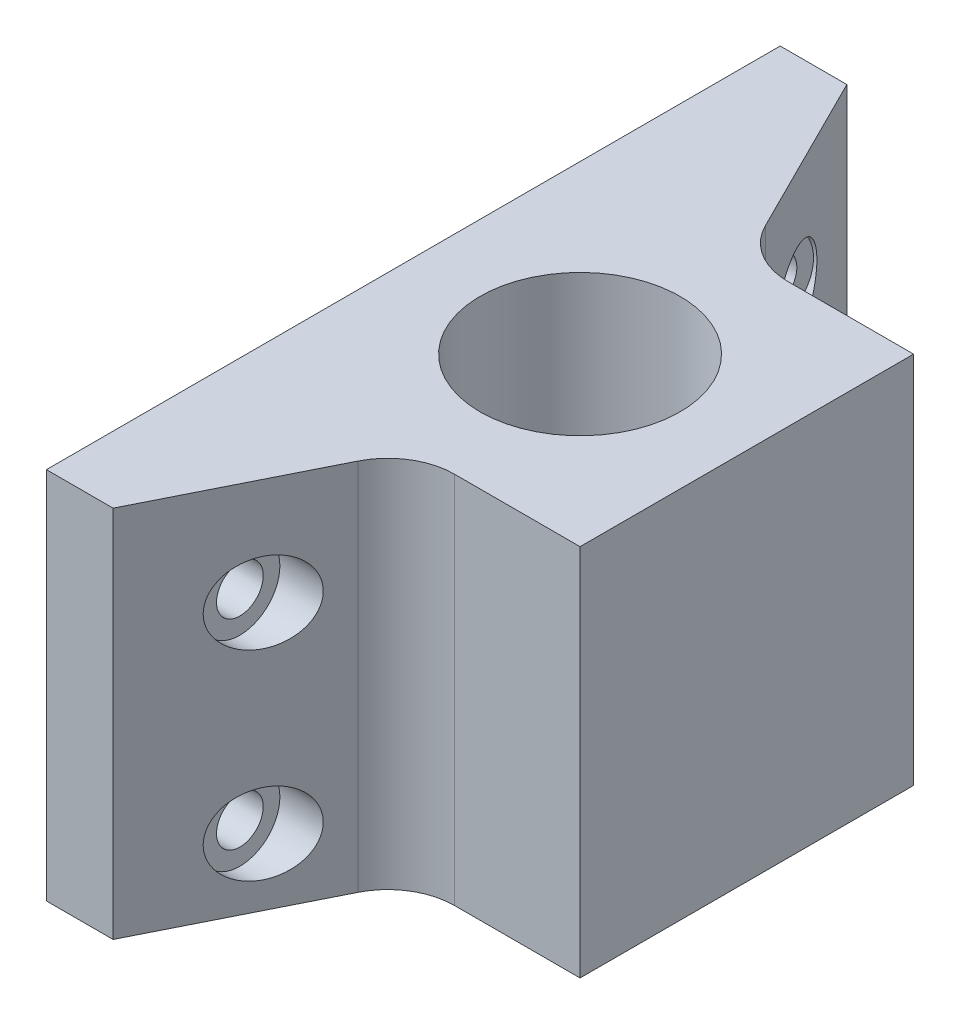
ISO-10303-21;
HEADER;
FILE_DESCRIPTION(('STEP AP214'),'2;1');
FILE_NAME('part.step','',(''),(''),'','','');
FILE_SCHEMA(('AUTOMOTIVE_DESIGN { 1 0 10303 214 1 1 1 1 }'));
ENDSEC;
DATA;
#1=APPLICATION_CONTEXT('core data for automotive mechanical design processes');
#2=APPLICATION_PROTOCOL_DEFINITION('international standard','automotive_design',2000,#1);
#3=PRODUCT_CONTEXT('',#1,'mechanical');
#4=PRODUCT('Part','Part','',(#3));
#5=PRODUCT_RELATED_PRODUCT_CATEGORY('part','',(#4));
#6=PRODUCT_DEFINITION_FORMATION('','',#4);
#7=PRODUCT_DEFINITION_CONTEXT('part definition',#1,'design');
#8=PRODUCT_DEFINITION('design','',#6,#7);
#9=PRODUCT_DEFINITION_SHAPE('','',#8);
#10=(LENGTH_UNIT() NAMED_UNIT(*) SI_UNIT(.MILLI.,.METRE.));
#11=(NAMED_UNIT(*) PLANE_ANGLE_UNIT() SI_UNIT($,.RADIAN.));
#12=(NAMED_UNIT(*) SI_UNIT($,.STERADIAN.) SOLID_ANGLE_UNIT());
#13=UNCERTAINTY_MEASURE_WITH_UNIT(LENGTH_MEASURE(1.E-05),#10,'distance_accuracy_value','');
#14=(GEOMETRIC_REPRESENTATION_CONTEXT(3) GLOBAL_UNCERTAINTY_ASSIGNED_CONTEXT((#13)) GLOBAL_UNIT_ASSIGNED_CONTEXT((#10,
#11,#12)) REPRESENTATION_CONTEXT('',''));
#15=CARTESIAN_POINT('',(0.,0.,0.));
#16=DIRECTION('',(0.,0.,1.));
#17=DIRECTION('',(1.,0.,0.));
#18=AXIS2_PLACEMENT_3D('',#15,#16,#17);
#19=CARTESIAN_POINT('',(0.500000000000002,5.,-20.));
#20=DIRECTION('',(-1.,0.,0.));
#21=DIRECTION('',(0.,0.,1.));
#22=AXIS2_PLACEMENT_3D('',#19,#20,#21);
#23=CYLINDRICAL_SURFACE('',#22,1.75);
#24=CARTESIAN_POINT('',(-12.5,5.,-20.));
#25=DIRECTION('',(-1.,0.,0.));
#26=DIRECTION('',(0.,0.,-1.));
#27=AXIS2_PLACEMENT_3D('',#24,#25,#26);
#28=CIRCLE('',#27,1.75);
#29=CARTESIAN_POINT('',(-12.5,5.,-21.75));
#30=VERTEX_POINT('',#29);
#31=EDGE_CURVE('E284',#30,#30,#28,.T.);
#32=ORIENTED_EDGE('',*,*,#31,.T.);
#33=EDGE_LOOP('',(#32));
#34=FACE_BOUND('',#33,.T.);
#35=CARTESIAN_POINT('',(-5.49999999999999,5.,-20.));
#36=DIRECTION('',(1.,0.,0.));
#37=DIRECTION('',(0.,0.,-1.));
#38=AXIS2_PLACEMENT_3D('',#35,#36,#37);
#39=CIRCLE('',#38,1.75);
#40=CARTESIAN_POINT('',(-5.49999999999999,5.,-21.75));
#41=VERTEX_POINT('',#40);
#42=EDGE_CURVE('E257',#41,#41,#39,.F.);
#43=ORIENTED_EDGE('',*,*,#42,.F.);
#44=EDGE_LOOP('',(#43));
#45=FACE_BOUND('',#44,.T.);
#46=ADVANCED_FACE('F43',(#34,#45),#23,.F.);
#47=CARTESIAN_POINT('',(0.500000000000002,20.,-20.));
#48=DIRECTION('',(-1.,0.,0.));
#49=DIRECTION('',(0.,0.,1.));
#50=AXIS2_PLACEMENT_3D('',#47,#48,#49);
#51=CYLINDRICAL_SURFACE('',#50,1.75);
#52=CARTESIAN_POINT('',(-12.5,20.,-20.));
#53=DIRECTION('',(-1.,0.,0.));
#54=DIRECTION('',(0.,0.,-1.));
#55=AXIS2_PLACEMENT_3D('',#52,#53,#54);
#56=CIRCLE('',#55,1.75);
#57=CARTESIAN_POINT('',(-12.5,20.,-21.75));
#58=VERTEX_POINT('',#57);
#59=EDGE_CURVE('E289',#58,#58,#56,.T.);
#60=ORIENTED_EDGE('',*,*,#59,.T.);
#61=EDGE_LOOP('',(#60));
#62=FACE_BOUND('',#61,.T.);
#63=CARTESIAN_POINT('',(-5.49999999999999,20.,-20.));
#64=DIRECTION('',(1.,0.,0.));
#65=DIRECTION('',(0.,0.,-1.));
#66=AXIS2_PLACEMENT_3D('',#63,#64,#65);
#67=CIRCLE('',#66,1.75);
#68=CARTESIAN_POINT('',(-5.49999999999999,20.,-21.75));
#69=VERTEX_POINT('',#68);
#70=EDGE_CURVE('E253',#69,#69,#67,.F.);
#71=ORIENTED_EDGE('',*,*,#70,.F.);
#72=EDGE_LOOP('',(#71));
#73=FACE_BOUND('',#72,.T.);
#74=ADVANCED_FACE('F356',(#62,#73),#51,.F.);
#75=CARTESIAN_POINT('',(-12.5,28.,-12.5));
#76=DIRECTION('',(0.,0.,1.));
#77=DIRECTION('',(1.,0.,0.));
#78=AXIS2_PLACEMENT_3D('',#75,#76,#77);
#79=PLANE('',#78);
#80=DIRECTION('',(-1.,0.,0.));
#81=VECTOR('',#80,1.);
#82=CARTESIAN_POINT('',(-12.5,0.,-12.5));
#83=LINE('',#82,#81);
#84=CARTESIAN_POINT('',(12.5,0.,-12.5));
#85=VERTEX_POINT('',#84);
#86=CARTESIAN_POINT('',(3.09016994374948,0.,-12.5));
#87=VERTEX_POINT('',#86);
#88=EDGE_CURVE('E211',#85,#87,#83,.T.);
#89=ORIENTED_EDGE('',*,*,#88,.T.);
#90=DIRECTION('',(0.,-1.,0.));
#91=VECTOR('',#90,1.);
#92=CARTESIAN_POINT('',(3.09016994374948,28.,-12.5));
#93=LINE('',#92,#91);
#94=CARTESIAN_POINT('',(3.09016994374948,28.,-12.5));
#95=VERTEX_POINT('',#94);
#96=EDGE_CURVE('E67',#87,#95,#93,.F.);
#97=ORIENTED_EDGE('',*,*,#96,.T.);
#98=DIRECTION('',(-1.,0.,0.));
#99=VECTOR('',#98,1.);
#100=CARTESIAN_POINT('',(-12.5,28.,-12.5));
#101=LINE('',#100,#99);
#102=CARTESIAN_POINT('',(12.5,28.,-12.5));
#103=VERTEX_POINT('',#102);
#104=EDGE_CURVE('E196',#103,#95,#101,.T.);
#105=ORIENTED_EDGE('',*,*,#104,.F.);
#106=DIRECTION('',(0.,-1.,0.));
#107=VECTOR('',#106,1.);
#108=CARTESIAN_POINT('',(12.5,28.,-12.5));
#109=LINE('',#108,#107);
#110=EDGE_CURVE('E223',#103,#85,#109,.T.);
#111=ORIENTED_EDGE('',*,*,#110,.T.);
#112=EDGE_LOOP('',(#89,#97,#105,#111));
#113=FACE_BOUND('',#112,.T.);
#114=ADVANCED_FACE('F331',(#113),#79,.F.);
#115=CARTESIAN_POINT('',(0.,-2.,0.));
#116=DIRECTION('',(0.,1.,0.));
#117=DIRECTION('',(0.,0.,1.));
#118=AXIS2_PLACEMENT_3D('',#115,#116,#117);
#119=CYLINDRICAL_SURFACE('',#118,5.);
#120=CARTESIAN_POINT('',(0.,0.,0.));
#121=DIRECTION('',(0.,1.,0.));
#122=DIRECTION('',(0.,0.,1.));
#123=AXIS2_PLACEMENT_3D('',#120,#121,#122);
#124=CIRCLE('',#123,5.);
#125=CARTESIAN_POINT('',(0.,0.,5.));
#126=VERTEX_POINT('',#125);
#127=EDGE_CURVE('E212',#126,#126,#124,.T.);
#128=ORIENTED_EDGE('',*,*,#127,.F.);
#129=EDGE_LOOP('',(#128));
#130=FACE_BOUND('',#129,.T.);
#131=CARTESIAN_POINT('',(0.,3.,0.));
#132=DIRECTION('',(0.,1.,0.));
#133=DIRECTION('',(0.,0.,1.));
#134=AXIS2_PLACEMENT_3D('',#131,#132,#133);
#135=CIRCLE('',#134,5.);
#136=CARTESIAN_POINT('',(0.,3.,5.));
#137=VERTEX_POINT('',#136);
#138=EDGE_CURVE('E191',#137,#137,#135,.F.);
#139=ORIENTED_EDGE('',*,*,#138,.F.);
#140=EDGE_LOOP('',(#139));
#141=FACE_BOUND('',#140,.T.);
#142=ADVANCED_FACE('F564',(#130,#141),#119,.F.);
#143=CARTESIAN_POINT('',(12.5,28.,-12.5));
#144=DIRECTION('',(-1.,0.,0.));
#145=DIRECTION('',(0.,0.,1.));
#146=AXIS2_PLACEMENT_3D('',#143,#144,#145);
#147=PLANE('',#146);
#148=DIRECTION('',(0.,0.,-1.));
#149=VECTOR('',#148,1.);
#150=CARTESIAN_POINT('',(12.5,0.,-12.5));
#151=LINE('',#150,#149);
#152=CARTESIAN_POINT('',(12.5,0.,12.5));
#153=VERTEX_POINT('',#152);
#154=EDGE_CURVE('E207',#153,#85,#151,.T.);
#155=ORIENTED_EDGE('',*,*,#154,.T.);
#156=ORIENTED_EDGE('',*,*,#110,.F.);
#157=DIRECTION('',(0.,0.,-1.));
#158=VECTOR('',#157,1.);
#159=CARTESIAN_POINT('',(12.5,28.,-12.5));
#160=LINE('',#159,#158);
#161=CARTESIAN_POINT('',(12.5,28.,12.5));
#162=VERTEX_POINT('',#161);
#163=EDGE_CURVE('E192',#162,#103,#160,.T.);
#164=ORIENTED_EDGE('',*,*,#163,.F.);
#165=DIRECTION('',(0.,-1.,0.));
#166=VECTOR('',#165,1.);
#167=CARTESIAN_POINT('',(12.5,28.,12.5));
#168=LINE('',#167,#166);
#169=EDGE_CURVE('E206',#162,#153,#168,.T.);
#170=ORIENTED_EDGE('',*,*,#169,.T.);
#171=EDGE_LOOP('',(#155,#156,#164,#170));
#172=FACE_BOUND('',#171,.T.);
#173=ADVANCED_FACE('F309',(#172),#147,.F.);
#174=CARTESIAN_POINT('',(-12.5,28.,-12.5));
#175=DIRECTION('',(1.,0.,0.));
#176=DIRECTION('',(0.,0.,-1.));
#177=AXIS2_PLACEMENT_3D('',#174,#175,#176);
#178=PLANE('',#177);
#179=CARTESIAN_POINT('',(-12.5,5.,20.));
#180=DIRECTION('',(-1.,0.,0.));
#181=DIRECTION('',(0.,0.,1.));
#182=AXIS2_PLACEMENT_3D('',#179,#180,#181);
#183=CIRCLE('',#182,1.75);
#184=CARTESIAN_POINT('',(-12.5,5.,21.75));
#185=VERTEX_POINT('',#184);
#186=EDGE_CURVE('E152',#185,#185,#183,.T.);
#187=ORIENTED_EDGE('',*,*,#186,.F.);
#188=EDGE_LOOP('',(#187));
#189=FACE_BOUND('',#188,.T.);
#190=ORIENTED_EDGE('',*,*,#59,.F.);
#191=EDGE_LOOP('',(#190));
#192=FACE_BOUND('',#191,.T.);
#193=ORIENTED_EDGE('',*,*,#31,.F.);
#194=EDGE_LOOP('',(#193));
#195=FACE_BOUND('',#194,.T.);
#196=CARTESIAN_POINT('',(-12.5,20.,20.));
#197=DIRECTION('',(-1.,0.,0.));
#198=DIRECTION('',(0.,0.,1.));
#199=AXIS2_PLACEMENT_3D('',#196,#197,#198);
#200=CIRCLE('',#199,1.75);
#201=CARTESIAN_POINT('',(-12.5,20.,21.75));
#202=VERTEX_POINT('',#201);
#203=EDGE_CURVE('E148',#202,#202,#200,.T.);
#204=ORIENTED_EDGE('',*,*,#203,.F.);
#205=EDGE_LOOP('',(#204));
#206=FACE_BOUND('',#205,.T.);
#207=DIRECTION('',(0.,0.,1.));
#208=VECTOR('',#207,1.);
#209=CARTESIAN_POINT('',(-12.5,0.,-12.5));
#210=LINE('',#209,#208);
#211=CARTESIAN_POINT('',(-12.5,0.,-27.5));
#212=VERTEX_POINT('',#211);
#213=CARTESIAN_POINT('',(-12.5,0.,27.5));
#214=VERTEX_POINT('',#213);
#215=EDGE_CURVE('E215',#212,#214,#210,.T.);
#216=ORIENTED_EDGE('',*,*,#215,.T.);
#217=DIRECTION('',(0.,-1.,0.));
#218=VECTOR('',#217,1.);
#219=CARTESIAN_POINT('',(-12.5,47.5256241897666,27.5));
#220=LINE('',#219,#218);
#221=CARTESIAN_POINT('',(-12.5,28.,27.5));
#222=VERTEX_POINT('',#221);
#223=EDGE_CURVE('E146',#222,#214,#220,.T.);
#224=ORIENTED_EDGE('',*,*,#223,.F.);
#225=DIRECTION('',(0.,0.,1.));
#226=VECTOR('',#225,1.);
#227=CARTESIAN_POINT('',(-12.5,28.,-12.5));
#228=LINE('',#227,#226);
#229=CARTESIAN_POINT('',(-12.5,28.,-27.5));
#230=VERTEX_POINT('',#229);
#231=EDGE_CURVE('E200',#230,#222,#228,.T.);
#232=ORIENTED_EDGE('',*,*,#231,.F.);
#233=DIRECTION('',(0.,-1.,0.));
#234=VECTOR('',#233,1.);
#235=CARTESIAN_POINT('',(-12.5,47.5256241897666,-27.5));
#236=LINE('',#235,#234);
#237=EDGE_CURVE('E165',#230,#212,#236,.T.);
#238=ORIENTED_EDGE('',*,*,#237,.T.);
#239=EDGE_LOOP('',(#216,#224,#232,#238));
#240=FACE_BOUND('',#239,.T.);
#241=ADVANCED_FACE('F305',(#189,#192,#195,#206,#240),#178,.F.);
#242=CARTESIAN_POINT('',(-12.5,28.,12.5));
#243=DIRECTION('',(0.,0.,-1.));
#244=DIRECTION('',(-1.,0.,0.));
#245=AXIS2_PLACEMENT_3D('',#242,#243,#244);
#246=PLANE('',#245);
#247=DIRECTION('',(1.,0.,0.));
#248=VECTOR('',#247,1.);
#249=CARTESIAN_POINT('',(-12.5,28.,12.5));
#250=LINE('',#249,#248);
#251=CARTESIAN_POINT('',(3.09016994374948,28.,12.5));
#252=VERTEX_POINT('',#251);
#253=EDGE_CURVE('E203',#252,#162,#250,.T.);
#254=ORIENTED_EDGE('',*,*,#253,.F.);
#255=DIRECTION('',(0.,-1.,0.));
#256=VECTOR('',#255,1.);
#257=CARTESIAN_POINT('',(3.09016994374948,28.,12.5));
#258=LINE('',#257,#256);
#259=CARTESIAN_POINT('',(3.09016994374948,0.,12.5));
#260=VERTEX_POINT('',#259);
#261=EDGE_CURVE('E227',#252,#260,#258,.T.);
#262=ORIENTED_EDGE('',*,*,#261,.T.);
#263=DIRECTION('',(1.,0.,0.));
#264=VECTOR('',#263,1.);
#265=CARTESIAN_POINT('',(-12.5,0.,12.5));
#266=LINE('',#265,#264);
#267=EDGE_CURVE('E197',#260,#153,#266,.T.);
#268=ORIENTED_EDGE('',*,*,#267,.T.);
#269=ORIENTED_EDGE('',*,*,#169,.F.);
#270=EDGE_LOOP('',(#254,#262,#268,#269));
#271=FACE_BOUND('',#270,.T.);
#272=ADVANCED_FACE('F308',(#271),#246,.F.);
#273=CARTESIAN_POINT('',(0.,28.,0.));
#274=DIRECTION('',(0.,1.,0.));
#275=DIRECTION('',(0.,0.,1.));
#276=AXIS2_PLACEMENT_3D('',#273,#274,#275);
#277=PLANE('',#276);
#278=CARTESIAN_POINT('',(0.,28.,0.));
#279=DIRECTION('',(0.,1.,0.));
#280=DIRECTION('',(0.,0.,1.));
#281=AXIS2_PLACEMENT_3D('',#278,#279,#280);
#282=CIRCLE('',#281,7.5);
#283=CARTESIAN_POINT('',(0.,28.,7.5));
#284=VERTEX_POINT('',#283);
#285=EDGE_CURVE('E173',#284,#284,#282,.T.);
#286=ORIENTED_EDGE('',*,*,#285,.F.);
#287=EDGE_LOOP('',(#286));
#288=FACE_BOUND('',#287,.T.);
#289=ORIENTED_EDGE('',*,*,#163,.T.);
#290=ORIENTED_EDGE('',*,*,#104,.T.);
#291=CARTESIAN_POINT('',(3.09016994374948,28.,-17.5));
#292=DIRECTION('',(0.,1.,0.));
#293=DIRECTION('',(0.,0.,1.));
#294=AXIS2_PLACEMENT_3D('',#291,#292,#293);
#295=CIRCLE('',#294,5.);
#296=CARTESIAN_POINT('',(-1.3819660112501,28.,-15.2639320225002));
#297=VERTEX_POINT('',#296);
#298=EDGE_CURVE('E12',#95,#297,#295,.F.);
#299=ORIENTED_EDGE('',*,*,#298,.T.);
#300=DIRECTION('',(0.447213595499958,0.,0.894427190999916));
#301=VECTOR('',#300,1.);
#302=CARTESIAN_POINT('',(-7.5,28.,-27.5));
#303=LINE('',#302,#301);
#304=CARTESIAN_POINT('',(-7.5,28.,-27.5));
#305=VERTEX_POINT('',#304);
#306=EDGE_CURVE('E169',#305,#297,#303,.T.);
#307=ORIENTED_EDGE('',*,*,#306,.F.);
#308=DIRECTION('',(1.,0.,0.));
#309=VECTOR('',#308,1.);
#310=CARTESIAN_POINT('',(-12.5,28.,-27.5));
#311=LINE('',#310,#309);
#312=EDGE_CURVE('E175',#230,#305,#311,.T.);
#313=ORIENTED_EDGE('',*,*,#312,.F.);
#314=ORIENTED_EDGE('',*,*,#231,.T.);
#315=DIRECTION('',(-1.,0.,0.));
#316=VECTOR('',#315,1.);
#317=CARTESIAN_POINT('',(-12.5,28.,27.5));
#318=LINE('',#317,#316);
#319=CARTESIAN_POINT('',(-7.5,28.,27.5));
#320=VERTEX_POINT('',#319);
#321=EDGE_CURVE('E141',#320,#222,#318,.T.);
#322=ORIENTED_EDGE('',*,*,#321,.F.);
#323=DIRECTION('',(-0.447213595499958,0.,0.894427190999916));
#324=VECTOR('',#323,1.);
#325=CARTESIAN_POINT('',(-7.5,28.,27.5));
#326=LINE('',#325,#324);
#327=CARTESIAN_POINT('',(-1.3819660112501,28.,15.2639320225002));
#328=VERTEX_POINT('',#327);
#329=EDGE_CURVE('E131',#328,#320,#326,.T.);
#330=ORIENTED_EDGE('',*,*,#329,.F.);
#331=CARTESIAN_POINT('',(3.09016994374948,28.,17.5));
#332=DIRECTION('',(0.,1.,0.));
#333=DIRECTION('',(0.,0.,1.));
#334=AXIS2_PLACEMENT_3D('',#331,#332,#333);
#335=CIRCLE('',#334,5.);
#336=EDGE_CURVE('E248',#328,#252,#335,.F.);
#337=ORIENTED_EDGE('',*,*,#336,.T.);
#338=ORIENTED_EDGE('',*,*,#253,.T.);
#339=EDGE_LOOP('',(#289,#290,#299,#307,#313,#314,#322,#330,#337,#338));
#340=FACE_BOUND('',#339,.T.);
#341=ADVANCED_FACE('F327',(#288,#340),#277,.T.);
#342=CARTESIAN_POINT('',(0.,0.,0.));
#343=DIRECTION('',(0.,1.,0.));
#344=DIRECTION('',(0.,0.,1.));
#345=AXIS2_PLACEMENT_3D('',#342,#343,#344);
#346=PLANE('',#345);
#347=ORIENTED_EDGE('',*,*,#127,.T.);
#348=EDGE_LOOP('',(#347));
#349=FACE_BOUND('',#348,.T.);
#350=ORIENTED_EDGE('',*,*,#154,.F.);
#351=ORIENTED_EDGE('',*,*,#267,.F.);
#352=CARTESIAN_POINT('',(3.09016994374948,0.,17.5));
#353=DIRECTION('',(0.,1.,0.));
#354=DIRECTION('',(0.,0.,1.));
#355=AXIS2_PLACEMENT_3D('',#352,#353,#354);
#356=CIRCLE('',#355,5.);
#357=CARTESIAN_POINT('',(-1.3819660112501,0.,15.2639320225002));
#358=VERTEX_POINT('',#357);
#359=EDGE_CURVE('E127',#260,#358,#356,.T.);
#360=ORIENTED_EDGE('',*,*,#359,.T.);
#361=DIRECTION('',(-0.447213595499958,0.,0.894427190999916));
#362=VECTOR('',#361,1.);
#363=CARTESIAN_POINT('',(-7.5,0.,27.5));
#364=LINE('',#363,#362);
#365=CARTESIAN_POINT('',(-7.5,0.,27.5));
#366=VERTEX_POINT('',#365);
#367=EDGE_CURVE('E120',#358,#366,#364,.T.);
#368=ORIENTED_EDGE('',*,*,#367,.T.);
#369=DIRECTION('',(-1.,0.,0.));
#370=VECTOR('',#369,1.);
#371=CARTESIAN_POINT('',(-12.5,0.,27.5));
#372=LINE('',#371,#370);
#373=EDGE_CURVE('E125',#366,#214,#372,.T.);
#374=ORIENTED_EDGE('',*,*,#373,.T.);
#375=ORIENTED_EDGE('',*,*,#215,.F.);
#376=DIRECTION('',(1.,0.,0.));
#377=VECTOR('',#376,1.);
#378=CARTESIAN_POINT('',(-12.5,0.,-27.5));
#379=LINE('',#378,#377);
#380=CARTESIAN_POINT('',(-7.5,0.,-27.5));
#381=VERTEX_POINT('',#380);
#382=EDGE_CURVE('E161',#212,#381,#379,.T.);
#383=ORIENTED_EDGE('',*,*,#382,.T.);
#384=DIRECTION('',(0.447213595499958,0.,0.894427190999916));
#385=VECTOR('',#384,1.);
#386=CARTESIAN_POINT('',(-7.5,0.,-27.5));
#387=LINE('',#386,#385);
#388=CARTESIAN_POINT('',(-1.3819660112501,0.,-15.2639320225002));
#389=VERTEX_POINT('',#388);
#390=EDGE_CURVE('E162',#381,#389,#387,.T.);
#391=ORIENTED_EDGE('',*,*,#390,.T.);
#392=CARTESIAN_POINT('',(3.09016994374948,0.,-17.5));
#393=DIRECTION('',(0.,1.,0.));
#394=DIRECTION('',(0.,0.,1.));
#395=AXIS2_PLACEMENT_3D('',#392,#393,#394);
#396=CIRCLE('',#395,5.);
#397=EDGE_CURVE('E53',#389,#87,#396,.T.);
#398=ORIENTED_EDGE('',*,*,#397,.T.);
#399=ORIENTED_EDGE('',*,*,#88,.F.);
#400=EDGE_LOOP('',(#350,#351,#360,#368,#374,#375,#383,#391,#398,#399));
#401=FACE_BOUND('',#400,.T.);
#402=ADVANCED_FACE('F123',(#349,#401),#346,.F.);
#403=CARTESIAN_POINT('',(0.,3.,0.));
#404=DIRECTION('',(0.,1.,0.));
#405=DIRECTION('',(0.,0.,1.));
#406=AXIS2_PLACEMENT_3D('',#403,#404,#405);
#407=PLANE('',#406);
#408=CARTESIAN_POINT('',(0.,3.,0.));
#409=DIRECTION('',(0.,1.,0.));
#410=DIRECTION('',(0.,0.,1.));
#411=AXIS2_PLACEMENT_3D('',#408,#409,#410);
#412=CIRCLE('',#411,7.5);
#413=CARTESIAN_POINT('',(0.,3.,7.5));
#414=VERTEX_POINT('',#413);
#415=EDGE_CURVE('E187',#414,#414,#412,.F.);
#416=ORIENTED_EDGE('',*,*,#415,.F.);
#417=EDGE_LOOP('',(#416));
#418=FACE_BOUND('',#417,.T.);
#419=ORIENTED_EDGE('',*,*,#138,.T.);
#420=EDGE_LOOP('',(#419));
#421=FACE_BOUND('',#420,.T.);
#422=ADVANCED_FACE('F351',(#418,#421),#407,.T.);
#423=CARTESIAN_POINT('',(0.,-21.2132034355964,0.));
#424=DIRECTION('',(0.,1.,0.));
#425=DIRECTION('',(0.,0.,1.));
#426=AXIS2_PLACEMENT_3D('',#423,#424,#425);
#427=CYLINDRICAL_SURFACE('',#426,7.5);
#428=ORIENTED_EDGE('',*,*,#415,.T.);
#429=EDGE_LOOP('',(#428));
#430=FACE_BOUND('',#429,.T.);
#431=ORIENTED_EDGE('',*,*,#285,.T.);
#432=EDGE_LOOP('',(#431));
#433=FACE_BOUND('',#432,.T.);
#434=ADVANCED_FACE('F342',(#430,#433),#427,.F.);
#435=CARTESIAN_POINT('',(-12.5,47.5256241897666,-27.5));
#436=DIRECTION('',(0.,0.,-1.));
#437=DIRECTION('',(-1.,0.,0.));
#438=AXIS2_PLACEMENT_3D('',#435,#436,#437);
#439=PLANE('',#438);
#440=ORIENTED_EDGE('',*,*,#237,.F.);
#441=ORIENTED_EDGE('',*,*,#312,.T.);
#442=DIRECTION('',(0.,-1.,0.));
#443=VECTOR('',#442,1.);
#444=CARTESIAN_POINT('',(-7.5,47.5256241897666,-27.5));
#445=LINE('',#444,#443);
#446=EDGE_CURVE('E174',#305,#381,#445,.T.);
#447=ORIENTED_EDGE('',*,*,#446,.T.);
#448=ORIENTED_EDGE('',*,*,#382,.F.);
#449=EDGE_LOOP('',(#440,#441,#447,#448));
#450=FACE_BOUND('',#449,.T.);
#451=ADVANCED_FACE('F340',(#450),#439,.T.);
#452=CARTESIAN_POINT('',(-7.5,47.5256241897666,-27.5));
#453=DIRECTION('',(0.894427190999916,0.,-0.447213595499958));
#454=DIRECTION('',(-0.447213595499958,0.,-0.894427190999916));
#455=AXIS2_PLACEMENT_3D('',#452,#453,#454);
#456=PLANE('',#455);
#457=CARTESIAN_POINT('',(-3.75,5.,-20.));
#458=DIRECTION('',(0.894427190999916,0.,-0.447213595499958));
#459=DIRECTION('',(0.447213595499958,0.,0.894427190999916));
#460=AXIS2_PLACEMENT_3D('',#457,#458,#459);
#461=ELLIPSE('',#460,3.35410196624968,3.);
#462=CARTESIAN_POINT('',(-2.25,5.,-17.));
#463=VERTEX_POINT('',#462);
#464=EDGE_CURVE('E47',#463,#463,#461,.T.);
#465=ORIENTED_EDGE('',*,*,#464,.F.);
#466=EDGE_LOOP('',(#465));
#467=FACE_BOUND('',#466,.T.);
#468=CARTESIAN_POINT('',(-3.75,20.,-20.));
#469=DIRECTION('',(0.894427190999916,0.,-0.447213595499958));
#470=DIRECTION('',(0.447213595499958,0.,0.894427190999916));
#471=AXIS2_PLACEMENT_3D('',#468,#469,#470);
#472=ELLIPSE('',#471,3.35410196624968,3.);
#473=CARTESIAN_POINT('',(-2.25,20.,-17.));
#474=VERTEX_POINT('',#473);
#475=EDGE_CURVE('E277',#474,#474,#472,.T.);
#476=ORIENTED_EDGE('',*,*,#475,.F.);
#477=EDGE_LOOP('',(#476));
#478=FACE_BOUND('',#477,.T.);
#479=ORIENTED_EDGE('',*,*,#306,.T.);
#480=DIRECTION('',(0.,-1.,0.));
#481=VECTOR('',#480,1.);
#482=CARTESIAN_POINT('',(-1.3819660112501,47.5256241897666,-15.2639320225002));
#483=LINE('',#482,#481);
#484=EDGE_CURVE('E240',#297,#389,#483,.T.);
#485=ORIENTED_EDGE('',*,*,#484,.T.);
#486=ORIENTED_EDGE('',*,*,#390,.F.);
#487=ORIENTED_EDGE('',*,*,#446,.F.);
#488=EDGE_LOOP('',(#479,#485,#486,#487));
#489=FACE_BOUND('',#488,.T.);
#490=ADVANCED_FACE('F322',(#467,#478,#489),#456,.T.);
#491=CARTESIAN_POINT('',(-7.5,47.5256241897666,27.5));
#492=DIRECTION('',(0.894427190999916,0.,0.447213595499958));
#493=DIRECTION('',(0.447213595499958,0.,-0.894427190999916));
#494=AXIS2_PLACEMENT_3D('',#491,#492,#493);
#495=PLANE('',#494);
#496=CARTESIAN_POINT('',(-3.75,20.,20.));
#497=DIRECTION('',(0.894427190999916,0.,0.447213595499958));
#498=DIRECTION('',(0.447213595499958,0.,-0.894427190999916));
#499=AXIS2_PLACEMENT_3D('',#496,#497,#498);
#500=ELLIPSE('',#499,3.35410196624968,3.);
#501=CARTESIAN_POINT('',(-2.25,20.,17.));
#502=VERTEX_POINT('',#501);
#503=EDGE_CURVE('E274',#502,#502,#500,.T.);
#504=ORIENTED_EDGE('',*,*,#503,.F.);
#505=EDGE_LOOP('',(#504));
#506=FACE_BOUND('',#505,.T.);
#507=CARTESIAN_POINT('',(-3.75,5.,20.));
#508=DIRECTION('',(0.894427190999916,0.,0.447213595499958));
#509=DIRECTION('',(0.447213595499958,0.,-0.894427190999916));
#510=AXIS2_PLACEMENT_3D('',#507,#508,#509);
#511=ELLIPSE('',#510,3.35410196624968,3.);
#512=CARTESIAN_POINT('',(-2.25,5.,17.));
#513=VERTEX_POINT('',#512);
#514=EDGE_CURVE('E270',#513,#513,#511,.T.);
#515=ORIENTED_EDGE('',*,*,#514,.F.);
#516=EDGE_LOOP('',(#515));
#517=FACE_BOUND('',#516,.T.);
#518=ORIENTED_EDGE('',*,*,#367,.F.);
#519=DIRECTION('',(0.,-1.,0.));
#520=VECTOR('',#519,1.);
#521=CARTESIAN_POINT('',(-1.3819660112501,47.5256241897666,15.2639320225002));
#522=LINE('',#521,#520);
#523=EDGE_CURVE('E237',#358,#328,#522,.F.);
#524=ORIENTED_EDGE('',*,*,#523,.T.);
#525=ORIENTED_EDGE('',*,*,#329,.T.);
#526=DIRECTION('',(0.,-1.,0.));
#527=VECTOR('',#526,1.);
#528=CARTESIAN_POINT('',(-7.5,47.5256241897666,27.5));
#529=LINE('',#528,#527);
#530=EDGE_CURVE('E134',#320,#366,#529,.T.);
#531=ORIENTED_EDGE('',*,*,#530,.T.);
#532=EDGE_LOOP('',(#518,#524,#525,#531));
#533=FACE_BOUND('',#532,.T.);
#534=ADVANCED_FACE('F135',(#506,#517,#533),#495,.T.);
#535=CARTESIAN_POINT('',(-12.5,47.5256241897666,27.5));
#536=DIRECTION('',(0.,0.,1.));
#537=DIRECTION('',(1.,0.,0.));
#538=AXIS2_PLACEMENT_3D('',#535,#536,#537);
#539=PLANE('',#538);
#540=ORIENTED_EDGE('',*,*,#530,.F.);
#541=ORIENTED_EDGE('',*,*,#321,.T.);
#542=ORIENTED_EDGE('',*,*,#223,.T.);
#543=ORIENTED_EDGE('',*,*,#373,.F.);
#544=EDGE_LOOP('',(#540,#541,#542,#543));
#545=FACE_BOUND('',#544,.T.);
#546=ADVANCED_FACE('F144',(#545),#539,.T.);
#547=CARTESIAN_POINT('',(3.09016994374948,28.,17.5));
#548=DIRECTION('',(0.,-1.,0.));
#549=DIRECTION('',(0.,0.,-1.));
#550=AXIS2_PLACEMENT_3D('',#547,#548,#549);
#551=CYLINDRICAL_SURFACE('',#550,5.);
#552=ORIENTED_EDGE('',*,*,#336,.F.);
#553=ORIENTED_EDGE('',*,*,#523,.F.);
#554=ORIENTED_EDGE('',*,*,#359,.F.);
#555=ORIENTED_EDGE('',*,*,#261,.F.);
#556=EDGE_LOOP('',(#552,#553,#554,#555));
#557=FACE_BOUND('',#556,.T.);
#558=ADVANCED_FACE('F339',(#557),#551,.F.);
#559=CARTESIAN_POINT('',(3.09016994374948,47.5256241897666,-17.5));
#560=DIRECTION('',(0.,-1.,0.));
#561=DIRECTION('',(0.,0.,-1.));
#562=AXIS2_PLACEMENT_3D('',#559,#560,#561);
#563=CYLINDRICAL_SURFACE('',#562,5.);
#564=ORIENTED_EDGE('',*,*,#298,.F.);
#565=ORIENTED_EDGE('',*,*,#96,.F.);
#566=ORIENTED_EDGE('',*,*,#397,.F.);
#567=ORIENTED_EDGE('',*,*,#484,.F.);
#568=EDGE_LOOP('',(#564,#565,#566,#567));
#569=FACE_BOUND('',#568,.T.);
#570=ADVANCED_FACE('F45',(#569),#563,.F.);
#571=CARTESIAN_POINT('',(0.500000000000009,20.,20.));
#572=DIRECTION('',(-1.,0.,0.));
#573=DIRECTION('',(0.,0.,1.));
#574=AXIS2_PLACEMENT_3D('',#571,#572,#573);
#575=CYLINDRICAL_SURFACE('',#574,1.75);
#576=CARTESIAN_POINT('',(-5.5,20.,20.));
#577=DIRECTION('',(-1.,0.,0.));
#578=DIRECTION('',(0.,0.,1.));
#579=AXIS2_PLACEMENT_3D('',#576,#577,#578);
#580=CIRCLE('',#579,1.75);
#581=CARTESIAN_POINT('',(-5.5,20.,21.75));
#582=VERTEX_POINT('',#581);
#583=EDGE_CURVE('E266',#582,#582,#580,.F.);
#584=ORIENTED_EDGE('',*,*,#583,.T.);
#585=EDGE_LOOP('',(#584));
#586=FACE_BOUND('',#585,.T.);
#587=ORIENTED_EDGE('',*,*,#203,.T.);
#588=EDGE_LOOP('',(#587));
#589=FACE_BOUND('',#588,.T.);
#590=ADVANCED_FACE('F371',(#586,#589),#575,.F.);
#591=CARTESIAN_POINT('',(0.500000000000009,5.,20.));
#592=DIRECTION('',(-1.,0.,0.));
#593=DIRECTION('',(0.,0.,1.));
#594=AXIS2_PLACEMENT_3D('',#591,#592,#593);
#595=CYLINDRICAL_SURFACE('',#594,1.75);
#596=CARTESIAN_POINT('',(-5.5,5.,20.));
#597=DIRECTION('',(-1.,0.,0.));
#598=DIRECTION('',(0.,0.,1.));
#599=AXIS2_PLACEMENT_3D('',#596,#597,#598);
#600=CIRCLE('',#599,1.75);
#601=CARTESIAN_POINT('',(-5.5,5.,21.75));
#602=VERTEX_POINT('',#601);
#603=EDGE_CURVE('E262',#602,#602,#600,.F.);
#604=ORIENTED_EDGE('',*,*,#603,.T.);
#605=EDGE_LOOP('',(#604));
#606=FACE_BOUND('',#605,.T.);
#607=ORIENTED_EDGE('',*,*,#186,.T.);
#608=EDGE_LOOP('',(#607));
#609=FACE_BOUND('',#608,.T.);
#610=ADVANCED_FACE('F303',(#606,#609),#595,.F.);
#611=CARTESIAN_POINT('',(-5.49999999999999,20.,-20.));
#612=DIRECTION('',(1.,0.,0.));
#613=DIRECTION('',(0.,0.,-1.));
#614=AXIS2_PLACEMENT_3D('',#611,#612,#613);
#615=PLANE('',#614);
#616=CARTESIAN_POINT('',(-5.49999999999999,20.,-20.));
#617=DIRECTION('',(1.,0.,0.));
#618=DIRECTION('',(0.,0.,-1.));
#619=AXIS2_PLACEMENT_3D('',#616,#617,#618);
#620=CIRCLE('',#619,3.);
#621=CARTESIAN_POINT('',(-5.49999999999999,20.,-23.));
#622=VERTEX_POINT('',#621);
#623=EDGE_CURVE('E258',#622,#622,#620,.T.);
#624=ORIENTED_EDGE('',*,*,#623,.T.);
#625=EDGE_LOOP('',(#624));
#626=FACE_BOUND('',#625,.T.);
#627=ORIENTED_EDGE('',*,*,#70,.T.);
#628=EDGE_LOOP('',(#627));
#629=FACE_BOUND('',#628,.T.);
#630=ADVANCED_FACE('F370',(#626,#629),#615,.T.);
#631=CARTESIAN_POINT('',(-5.49999999999999,20.,-20.));
#632=DIRECTION('',(1.,0.,0.));
#633=DIRECTION('',(0.,0.,-1.));
#634=AXIS2_PLACEMENT_3D('',#631,#632,#633);
#635=CYLINDRICAL_SURFACE('',#634,3.);
#636=ORIENTED_EDGE('',*,*,#475,.T.);
#637=EDGE_LOOP('',(#636));
#638=FACE_BOUND('',#637,.T.);
#639=ORIENTED_EDGE('',*,*,#623,.F.);
#640=EDGE_LOOP('',(#639));
#641=FACE_BOUND('',#640,.T.);
#642=ADVANCED_FACE('F367',(#638,#641),#635,.F.);
#643=CARTESIAN_POINT('',(-5.49999999999999,5.,-20.));
#644=DIRECTION('',(1.,0.,0.));
#645=DIRECTION('',(0.,0.,-1.));
#646=AXIS2_PLACEMENT_3D('',#643,#644,#645);
#647=PLANE('',#646);
#648=CARTESIAN_POINT('',(-5.49999999999999,5.,-20.));
#649=DIRECTION('',(1.,0.,0.));
#650=DIRECTION('',(0.,0.,-1.));
#651=AXIS2_PLACEMENT_3D('',#648,#649,#650);
#652=CIRCLE('',#651,3.);
#653=CARTESIAN_POINT('',(-5.49999999999999,5.,-23.));
#654=VERTEX_POINT('',#653);
#655=EDGE_CURVE('E402',#654,#654,#652,.T.);
#656=ORIENTED_EDGE('',*,*,#655,.T.);
#657=EDGE_LOOP('',(#656));
#658=FACE_BOUND('',#657,.T.);
#659=ORIENTED_EDGE('',*,*,#42,.T.);
#660=EDGE_LOOP('',(#659));
#661=FACE_BOUND('',#660,.T.);
#662=ADVANCED_FACE('F415',(#658,#661),#647,.T.);
#663=CARTESIAN_POINT('',(-5.49999999999999,5.,-20.));
#664=DIRECTION('',(1.,0.,0.));
#665=DIRECTION('',(0.,0.,-1.));
#666=AXIS2_PLACEMENT_3D('',#663,#664,#665);
#667=CYLINDRICAL_SURFACE('',#666,3.);
#668=ORIENTED_EDGE('',*,*,#464,.T.);
#669=EDGE_LOOP('',(#668));
#670=FACE_BOUND('',#669,.T.);
#671=ORIENTED_EDGE('',*,*,#655,.F.);
#672=EDGE_LOOP('',(#671));
#673=FACE_BOUND('',#672,.T.);
#674=ADVANCED_FACE('F420',(#670,#673),#667,.F.);
#675=CARTESIAN_POINT('',(-5.5,5.,20.));
#676=DIRECTION('',(-1.,0.,0.));
#677=DIRECTION('',(0.,0.,1.));
#678=AXIS2_PLACEMENT_3D('',#675,#676,#677);
#679=PLANE('',#678);
#680=CARTESIAN_POINT('',(-5.5,5.,20.));
#681=DIRECTION('',(1.,0.,0.));
#682=DIRECTION('',(0.,0.,1.));
#683=AXIS2_PLACEMENT_3D('',#680,#681,#682);
#684=CIRCLE('',#683,3.);
#685=CARTESIAN_POINT('',(-5.5,5.,23.));
#686=VERTEX_POINT('',#685);
#687=EDGE_CURVE('E395',#686,#686,#684,.T.);
#688=ORIENTED_EDGE('',*,*,#687,.T.);
#689=EDGE_LOOP('',(#688));
#690=FACE_BOUND('',#689,.T.);
#691=ORIENTED_EDGE('',*,*,#603,.F.);
#692=EDGE_LOOP('',(#691));
#693=FACE_BOUND('',#692,.T.);
#694=ADVANCED_FACE('F391',(#690,#693),#679,.F.);
#695=CARTESIAN_POINT('',(-5.5,5.,20.));
#696=DIRECTION('',(1.,0.,0.));
#697=DIRECTION('',(0.,0.,-1.));
#698=AXIS2_PLACEMENT_3D('',#695,#696,#697);
#699=CYLINDRICAL_SURFACE('',#698,3.);
#700=ORIENTED_EDGE('',*,*,#514,.T.);
#701=EDGE_LOOP('',(#700));
#702=FACE_BOUND('',#701,.T.);
#703=ORIENTED_EDGE('',*,*,#687,.F.);
#704=EDGE_LOOP('',(#703));
#705=FACE_BOUND('',#704,.T.);
#706=ADVANCED_FACE('F387',(#702,#705),#699,.F.);
#707=CARTESIAN_POINT('',(-5.5,20.,20.));
#708=DIRECTION('',(-1.,0.,0.));
#709=DIRECTION('',(0.,0.,1.));
#710=AXIS2_PLACEMENT_3D('',#707,#708,#709);
#711=PLANE('',#710);
#712=CARTESIAN_POINT('',(-5.5,20.,20.));
#713=DIRECTION('',(1.,0.,0.));
#714=DIRECTION('',(0.,0.,1.));
#715=AXIS2_PLACEMENT_3D('',#712,#713,#714);
#716=CIRCLE('',#715,3.);
#717=CARTESIAN_POINT('',(-5.5,20.,23.));
#718=VERTEX_POINT('',#717);
#719=EDGE_CURVE('E398',#718,#718,#716,.T.);
#720=ORIENTED_EDGE('',*,*,#719,.T.);
#721=EDGE_LOOP('',(#720));
#722=FACE_BOUND('',#721,.T.);
#723=ORIENTED_EDGE('',*,*,#583,.F.);
#724=EDGE_LOOP('',(#723));
#725=FACE_BOUND('',#724,.T.);
#726=ADVANCED_FACE('F390',(#722,#725),#711,.F.);
#727=CARTESIAN_POINT('',(-5.5,20.,20.));
#728=DIRECTION('',(1.,0.,0.));
#729=DIRECTION('',(0.,0.,-1.));
#730=AXIS2_PLACEMENT_3D('',#727,#728,#729);
#731=CYLINDRICAL_SURFACE('',#730,3.);
#732=ORIENTED_EDGE('',*,*,#503,.T.);
#733=EDGE_LOOP('',(#732));
#734=FACE_BOUND('',#733,.T.);
#735=ORIENTED_EDGE('',*,*,#719,.F.);
#736=EDGE_LOOP('',(#735));
#737=FACE_BOUND('',#736,.T.);
#738=ADVANCED_FACE('F425',(#734,#737),#731,.F.);
#739=CLOSED_SHELL('',(#46,#74,#114,#142,#173,#241,#272,#341,#402,#422,#434,#451,#490,#534,#546,
#558,#570,#590,#610,#630,#642,#662,#674,#694,#706,#726,#738));
#740=MANIFOLD_SOLID_BREP('B2',#739);
#741=ADVANCED_BREP_SHAPE_REPRESENTATION('',(#18,#740),#14);
#742=SHAPE_DEFINITION_REPRESENTATION(#9,#741);
ENDSEC;
END-ISO-10303-21;
